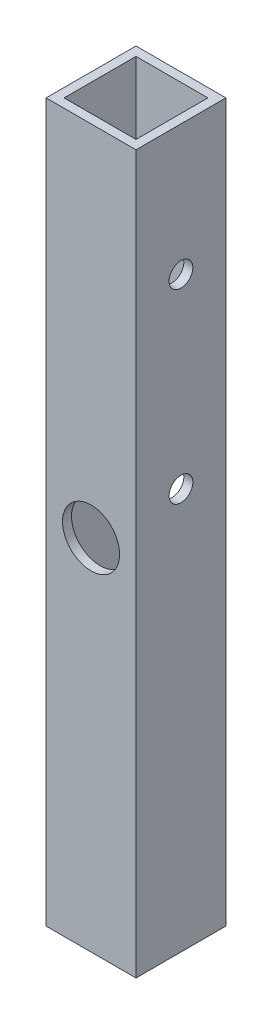
ISO-10303-21;
HEADER;
FILE_DESCRIPTION(('STEP AP214'),'2;1');
FILE_NAME('part.step','',(''),(''),'','','');
FILE_SCHEMA(('AUTOMOTIVE_DESIGN { 1 0 10303 214 1 1 1 1 }'));
ENDSEC;
DATA;
#1=APPLICATION_CONTEXT('core data for automotive mechanical design processes');
#2=APPLICATION_PROTOCOL_DEFINITION('international standard','automotive_design',2000,#1);
#3=PRODUCT_CONTEXT('',#1,'mechanical');
#4=PRODUCT('Part','Part','',(#3));
#5=PRODUCT_RELATED_PRODUCT_CATEGORY('part','',(#4));
#6=PRODUCT_DEFINITION_FORMATION('','',#4);
#7=PRODUCT_DEFINITION_CONTEXT('part definition',#1,'design');
#8=PRODUCT_DEFINITION('design','',#6,#7);
#9=PRODUCT_DEFINITION_SHAPE('','',#8);
#10=(LENGTH_UNIT() NAMED_UNIT(*) SI_UNIT(.MILLI.,.METRE.));
#11=(NAMED_UNIT(*) PLANE_ANGLE_UNIT() SI_UNIT($,.RADIAN.));
#12=(NAMED_UNIT(*) SI_UNIT($,.STERADIAN.) SOLID_ANGLE_UNIT());
#13=UNCERTAINTY_MEASURE_WITH_UNIT(LENGTH_MEASURE(1.E-05),#10,'distance_accuracy_value','');
#14=(GEOMETRIC_REPRESENTATION_CONTEXT(3) GLOBAL_UNCERTAINTY_ASSIGNED_CONTEXT((#13)) GLOBAL_UNIT_ASSIGNED_CONTEXT((#10,
#11,#12)) REPRESENTATION_CONTEXT('',''));
#15=CARTESIAN_POINT('',(0.,0.,0.));
#16=DIRECTION('',(0.,0.,1.));
#17=DIRECTION('',(1.,0.,0.));
#18=AXIS2_PLACEMENT_3D('',#15,#16,#17);
#19=CARTESIAN_POINT('',(0.,0.,2.));
#20=DIRECTION('',(0.,0.,-1.));
#21=DIRECTION('',(-1.,0.,0.));
#22=AXIS2_PLACEMENT_3D('',#19,#20,#21);
#23=PLANE('',#22);
#24=CARTESIAN_POINT('',(0.,0.,2.));
#25=DIRECTION('',(0.,0.,-1.));
#26=DIRECTION('',(-1.,0.,0.));
#27=AXIS2_PLACEMENT_3D('',#24,#25,#26);
#28=CIRCLE('',#27,6.35);
#29=CARTESIAN_POINT('',(-6.35,0.,2.));
#30=VERTEX_POINT('',#29);
#31=EDGE_CURVE('E132',#30,#30,#28,.T.);
#32=ORIENTED_EDGE('',*,*,#31,.T.);
#33=EDGE_LOOP('',(#32));
#34=FACE_BOUND('',#33,.T.);
#35=DIRECTION('',(0.,1.,0.));
#36=VECTOR('',#35,1.);
#37=CARTESIAN_POINT('',(-8.,-106.707248094147,2.));
#38=LINE('',#37,#36);
#39=CARTESIAN_POINT('',(-8.,-79.8,2.));
#40=VERTEX_POINT('',#39);
#41=CARTESIAN_POINT('',(-7.99999999999999,79.8,2.));
#42=VERTEX_POINT('',#41);
#43=EDGE_CURVE('E152',#40,#42,#38,.T.);
#44=ORIENTED_EDGE('',*,*,#43,.F.);
#45=DIRECTION('',(1.,0.,0.));
#46=VECTOR('',#45,1.);
#47=CARTESIAN_POINT('',(-10.,-79.8,2.));
#48=LINE('',#47,#46);
#49=CARTESIAN_POINT('',(8.00000000000001,-79.8,2.));
#50=VERTEX_POINT('',#49);
#51=EDGE_CURVE('E158',#40,#50,#48,.T.);
#52=ORIENTED_EDGE('',*,*,#51,.T.);
#53=DIRECTION('',(0.,1.,0.));
#54=VECTOR('',#53,1.);
#55=CARTESIAN_POINT('',(8.00000000000001,-106.707248094147,2.));
#56=LINE('',#55,#54);
#57=CARTESIAN_POINT('',(8.00000000000001,79.8,2.));
#58=VERTEX_POINT('',#57);
#59=EDGE_CURVE('E65',#50,#58,#56,.T.);
#60=ORIENTED_EDGE('',*,*,#59,.T.);
#61=DIRECTION('',(-1.,0.,0.));
#62=VECTOR('',#61,1.);
#63=CARTESIAN_POINT('',(-9.99999999999999,79.8,2.));
#64=LINE('',#63,#62);
#65=EDGE_CURVE('E60',#58,#42,#64,.T.);
#66=ORIENTED_EDGE('',*,*,#65,.T.);
#67=EDGE_LOOP('',(#44,#52,#60,#66));
#68=FACE_BOUND('',#67,.T.);
#69=ADVANCED_FACE('F43',(#34,#68),#23,.F.);
#70=CARTESIAN_POINT('',(-10.,-79.8,2.));
#71=DIRECTION('',(1.,0.,0.));
#72=DIRECTION('',(0.,1.,0.));
#73=AXIS2_PLACEMENT_3D('',#70,#71,#72);
#74=PLANE('',#73);
#75=CARTESIAN_POINT('',(-10.,50.7999999999958,9.99999999999549));
#76=DIRECTION('',(1.,0.,0.));
#77=DIRECTION('',(0.,1.,0.));
#78=AXIS2_PLACEMENT_3D('',#75,#76,#77);
#79=CIRCLE('',#78,2.65);
#80=CARTESIAN_POINT('',(-10.,53.4499999999958,9.99999999999549));
#81=VERTEX_POINT('',#80);
#82=EDGE_CURVE('E183',#81,#81,#79,.T.);
#83=ORIENTED_EDGE('',*,*,#82,.T.);
#84=EDGE_LOOP('',(#83));
#85=FACE_BOUND('',#84,.T.);
#86=CARTESIAN_POINT('',(-10.,9.4342712474527,9.99999999999938));
#87=DIRECTION('',(1.,0.,0.));
#88=DIRECTION('',(0.,1.,0.));
#89=AXIS2_PLACEMENT_3D('',#86,#87,#88);
#90=CIRCLE('',#89,2.65);
#91=CARTESIAN_POINT('',(-10.,12.0842712474527,9.99999999999938));
#92=VERTEX_POINT('',#91);
#93=EDGE_CURVE('E190',#92,#92,#90,.T.);
#94=ORIENTED_EDGE('',*,*,#93,.T.);
#95=EDGE_LOOP('',(#94));
#96=FACE_BOUND('',#95,.T.);
#97=DIRECTION('',(0.,-1.,0.));
#98=VECTOR('',#97,1.);
#99=CARTESIAN_POINT('',(-10.,-79.8,0.));
#100=LINE('',#99,#98);
#101=CARTESIAN_POINT('',(-9.99999999999999,79.8,0.));
#102=VERTEX_POINT('',#101);
#103=CARTESIAN_POINT('',(-10.,-79.8,0.));
#104=VERTEX_POINT('',#103);
#105=EDGE_CURVE('E157',#102,#104,#100,.T.);
#106=ORIENTED_EDGE('',*,*,#105,.T.);
#107=DIRECTION('',(0.,0.,-1.));
#108=VECTOR('',#107,1.);
#109=CARTESIAN_POINT('',(-10.,-79.8,2.));
#110=LINE('',#109,#108);
#111=CARTESIAN_POINT('',(-9.99999999999999,-79.8,20.));
#112=VERTEX_POINT('',#111);
#113=EDGE_CURVE('E11',#112,#104,#110,.T.);
#114=ORIENTED_EDGE('',*,*,#113,.F.);
#115=DIRECTION('',(0.,1.,0.));
#116=VECTOR('',#115,1.);
#117=CARTESIAN_POINT('',(-9.99999999999999,-106.707248094147,20.));
#118=LINE('',#117,#116);
#119=CARTESIAN_POINT('',(-9.99999999999999,79.8,20.));
#120=VERTEX_POINT('',#119);
#121=EDGE_CURVE('E149',#112,#120,#118,.T.);
#122=ORIENTED_EDGE('',*,*,#121,.T.);
#123=DIRECTION('',(0.,0.,-1.));
#124=VECTOR('',#123,1.);
#125=CARTESIAN_POINT('',(-9.99999999999999,79.8,2.));
#126=LINE('',#125,#124);
#127=EDGE_CURVE('E162',#120,#102,#126,.T.);
#128=ORIENTED_EDGE('',*,*,#127,.T.);
#129=EDGE_LOOP('',(#106,#114,#122,#128));
#130=FACE_BOUND('',#129,.T.);
#131=ADVANCED_FACE('F45',(#85,#96,#130),#74,.F.);
#132=CARTESIAN_POINT('',(-10.,-79.8,2.));
#133=DIRECTION('',(0.,1.,0.));
#134=DIRECTION('',(0.,0.,1.));
#135=AXIS2_PLACEMENT_3D('',#132,#133,#134);
#136=PLANE('',#135);
#137=ORIENTED_EDGE('',*,*,#51,.F.);
#138=DIRECTION('',(0.,0.,-1.));
#139=VECTOR('',#138,1.);
#140=CARTESIAN_POINT('',(-8.,-79.8,0.));
#141=LINE('',#140,#139);
#142=CARTESIAN_POINT('',(-7.99999999999999,-79.8,18.));
#143=VERTEX_POINT('',#142);
#144=EDGE_CURVE('E209',#143,#40,#141,.T.);
#145=ORIENTED_EDGE('',*,*,#144,.F.);
#146=DIRECTION('',(-1.,0.,0.));
#147=VECTOR('',#146,1.);
#148=CARTESIAN_POINT('',(0.,-79.8,18.));
#149=LINE('',#148,#147);
#150=CARTESIAN_POINT('',(8.00000000000001,-79.8,18.));
#151=VERTEX_POINT('',#150);
#152=EDGE_CURVE('E148',#151,#143,#149,.T.);
#153=ORIENTED_EDGE('',*,*,#152,.F.);
#154=DIRECTION('',(0.,0.,-1.));
#155=VECTOR('',#154,1.);
#156=CARTESIAN_POINT('',(8.00000000000001,-79.8,0.));
#157=LINE('',#156,#155);
#158=EDGE_CURVE('E116',#151,#50,#157,.T.);
#159=ORIENTED_EDGE('',*,*,#158,.T.);
#160=EDGE_LOOP('',(#137,#145,#153,#159));
#161=FACE_BOUND('',#160,.T.);
#162=DIRECTION('',(1.,0.,0.));
#163=VECTOR('',#162,1.);
#164=CARTESIAN_POINT('',(-10.,-79.8,0.));
#165=LINE('',#164,#163);
#166=CARTESIAN_POINT('',(10.,-79.8,0.));
#167=VERTEX_POINT('',#166);
#168=EDGE_CURVE('E165',#104,#167,#165,.T.);
#169=ORIENTED_EDGE('',*,*,#168,.T.);
#170=DIRECTION('',(0.,0.,-1.));
#171=VECTOR('',#170,1.);
#172=CARTESIAN_POINT('',(10.,-79.8,2.));
#173=LINE('',#172,#171);
#174=CARTESIAN_POINT('',(10.,-79.8,20.));
#175=VERTEX_POINT('',#174);
#176=EDGE_CURVE('E52',#175,#167,#173,.T.);
#177=ORIENTED_EDGE('',*,*,#176,.F.);
#178=DIRECTION('',(-1.,0.,0.));
#179=VECTOR('',#178,1.);
#180=CARTESIAN_POINT('',(0.,-79.8,20.));
#181=LINE('',#180,#179);
#182=EDGE_CURVE('E138',#175,#112,#181,.T.);
#183=ORIENTED_EDGE('',*,*,#182,.T.);
#184=ORIENTED_EDGE('',*,*,#113,.T.);
#185=EDGE_LOOP('',(#169,#177,#183,#184));
#186=FACE_BOUND('',#185,.T.);
#187=ADVANCED_FACE('F216',(#161,#186),#136,.F.);
#188=CARTESIAN_POINT('',(10.,-79.8,2.));
#189=DIRECTION('',(-1.,0.,0.));
#190=DIRECTION('',(0.,-1.,0.));
#191=AXIS2_PLACEMENT_3D('',#188,#189,#190);
#192=PLANE('',#191);
#193=CARTESIAN_POINT('',(10.,50.7999999999958,9.99999999999549));
#194=DIRECTION('',(-1.,0.,0.));
#195=DIRECTION('',(0.,-1.,0.));
#196=AXIS2_PLACEMENT_3D('',#193,#194,#195);
#197=CIRCLE('',#196,2.65);
#198=CARTESIAN_POINT('',(10.,48.1499999999958,9.99999999999549));
#199=VERTEX_POINT('',#198);
#200=EDGE_CURVE('E202',#199,#199,#197,.T.);
#201=ORIENTED_EDGE('',*,*,#200,.T.);
#202=EDGE_LOOP('',(#201));
#203=FACE_BOUND('',#202,.T.);
#204=CARTESIAN_POINT('',(10.,9.4342712474527,9.99999999999938));
#205=DIRECTION('',(-1.,0.,0.));
#206=DIRECTION('',(0.,-1.,0.));
#207=AXIS2_PLACEMENT_3D('',#204,#205,#206);
#208=CIRCLE('',#207,2.65);
#209=CARTESIAN_POINT('',(10.,6.78427124745271,9.99999999999938));
#210=VERTEX_POINT('',#209);
#211=EDGE_CURVE('E187',#210,#210,#208,.T.);
#212=ORIENTED_EDGE('',*,*,#211,.T.);
#213=EDGE_LOOP('',(#212));
#214=FACE_BOUND('',#213,.T.);
#215=DIRECTION('',(0.,1.,0.));
#216=VECTOR('',#215,1.);
#217=CARTESIAN_POINT('',(10.,-79.8,0.));
#218=LINE('',#217,#216);
#219=CARTESIAN_POINT('',(10.,79.8,0.));
#220=VERTEX_POINT('',#219);
#221=EDGE_CURVE('E167',#167,#220,#218,.T.);
#222=ORIENTED_EDGE('',*,*,#221,.T.);
#223=DIRECTION('',(0.,0.,-1.));
#224=VECTOR('',#223,1.);
#225=CARTESIAN_POINT('',(10.,79.8,2.));
#226=LINE('',#225,#224);
#227=CARTESIAN_POINT('',(10.,79.8,20.));
#228=VERTEX_POINT('',#227);
#229=EDGE_CURVE('E172',#228,#220,#226,.T.);
#230=ORIENTED_EDGE('',*,*,#229,.F.);
#231=DIRECTION('',(0.,1.,0.));
#232=VECTOR('',#231,1.);
#233=CARTESIAN_POINT('',(10.,-106.707248094147,20.));
#234=LINE('',#233,#232);
#235=EDGE_CURVE('E145',#175,#228,#234,.T.);
#236=ORIENTED_EDGE('',*,*,#235,.F.);
#237=ORIENTED_EDGE('',*,*,#176,.T.);
#238=EDGE_LOOP('',(#222,#230,#236,#237));
#239=FACE_BOUND('',#238,.T.);
#240=ADVANCED_FACE('F228',(#203,#214,#239),#192,.F.);
#241=CARTESIAN_POINT('',(-9.99999999999999,79.8,2.));
#242=DIRECTION('',(0.,-1.,0.));
#243=DIRECTION('',(0.,0.,-1.));
#244=AXIS2_PLACEMENT_3D('',#241,#242,#243);
#245=PLANE('',#244);
#246=DIRECTION('',(0.,0.,1.));
#247=VECTOR('',#246,1.);
#248=CARTESIAN_POINT('',(-8.,79.8,0.));
#249=LINE('',#248,#247);
#250=CARTESIAN_POINT('',(-7.99999999999999,79.8,18.));
#251=VERTEX_POINT('',#250);
#252=EDGE_CURVE('E128',#42,#251,#249,.T.);
#253=ORIENTED_EDGE('',*,*,#252,.F.);
#254=ORIENTED_EDGE('',*,*,#65,.F.);
#255=DIRECTION('',(0.,0.,1.));
#256=VECTOR('',#255,1.);
#257=CARTESIAN_POINT('',(8.00000000000001,79.8,0.));
#258=LINE('',#257,#256);
#259=CARTESIAN_POINT('',(8.00000000000001,79.8,18.));
#260=VERTEX_POINT('',#259);
#261=EDGE_CURVE('E114',#58,#260,#258,.T.);
#262=ORIENTED_EDGE('',*,*,#261,.T.);
#263=DIRECTION('',(1.,0.,0.));
#264=VECTOR('',#263,1.);
#265=CARTESIAN_POINT('',(0.,79.8,18.));
#266=LINE('',#265,#264);
#267=EDGE_CURVE('E122',#251,#260,#266,.T.);
#268=ORIENTED_EDGE('',*,*,#267,.F.);
#269=EDGE_LOOP('',(#253,#254,#262,#268));
#270=FACE_BOUND('',#269,.T.);
#271=DIRECTION('',(-1.,0.,0.));
#272=VECTOR('',#271,1.);
#273=CARTESIAN_POINT('',(-9.99999999999999,79.8,0.));
#274=LINE('',#273,#272);
#275=EDGE_CURVE('E160',#220,#102,#274,.T.);
#276=ORIENTED_EDGE('',*,*,#275,.T.);
#277=ORIENTED_EDGE('',*,*,#127,.F.);
#278=DIRECTION('',(1.,0.,0.));
#279=VECTOR('',#278,1.);
#280=CARTESIAN_POINT('',(0.,79.8,20.));
#281=LINE('',#280,#279);
#282=EDGE_CURVE('E142',#120,#228,#281,.T.);
#283=ORIENTED_EDGE('',*,*,#282,.T.);
#284=ORIENTED_EDGE('',*,*,#229,.T.);
#285=EDGE_LOOP('',(#276,#277,#283,#284));
#286=FACE_BOUND('',#285,.T.);
#287=ADVANCED_FACE('F130',(#270,#286),#245,.F.);
#288=CARTESIAN_POINT('',(0.,0.,0.));
#289=DIRECTION('',(0.,0.,-1.));
#290=DIRECTION('',(-1.,0.,0.));
#291=AXIS2_PLACEMENT_3D('',#288,#289,#290);
#292=PLANE('',#291);
#293=CARTESIAN_POINT('',(0.,0.,0.));
#294=DIRECTION('',(0.,0.,-1.));
#295=DIRECTION('',(-1.,0.,0.));
#296=AXIS2_PLACEMENT_3D('',#293,#294,#295);
#297=CIRCLE('',#296,6.35);
#298=CARTESIAN_POINT('',(-6.35,0.,0.));
#299=VERTEX_POINT('',#298);
#300=EDGE_CURVE('E135',#299,#299,#297,.T.);
#301=ORIENTED_EDGE('',*,*,#300,.F.);
#302=EDGE_LOOP('',(#301));
#303=FACE_BOUND('',#302,.T.);
#304=ORIENTED_EDGE('',*,*,#105,.F.);
#305=ORIENTED_EDGE('',*,*,#275,.F.);
#306=ORIENTED_EDGE('',*,*,#221,.F.);
#307=ORIENTED_EDGE('',*,*,#168,.F.);
#308=EDGE_LOOP('',(#304,#305,#306,#307));
#309=FACE_BOUND('',#308,.T.);
#310=ADVANCED_FACE('F225',(#303,#309),#292,.T.);
#311=CARTESIAN_POINT('',(0.,-106.707248094147,20.));
#312=DIRECTION('',(0.,0.,1.));
#313=DIRECTION('',(1.,0.,0.));
#314=AXIS2_PLACEMENT_3D('',#311,#312,#313);
#315=PLANE('',#314);
#316=CARTESIAN_POINT('',(0.,0.,20.));
#317=DIRECTION('',(0.,0.,-1.));
#318=DIRECTION('',(-1.,0.,0.));
#319=AXIS2_PLACEMENT_3D('',#316,#317,#318);
#320=CIRCLE('',#319,6.35);
#321=CARTESIAN_POINT('',(-6.35,0.,20.));
#322=VERTEX_POINT('',#321);
#323=EDGE_CURVE('E179',#322,#322,#320,.T.);
#324=ORIENTED_EDGE('',*,*,#323,.T.);
#325=EDGE_LOOP('',(#324));
#326=FACE_BOUND('',#325,.T.);
#327=ORIENTED_EDGE('',*,*,#182,.F.);
#328=ORIENTED_EDGE('',*,*,#235,.T.);
#329=ORIENTED_EDGE('',*,*,#282,.F.);
#330=ORIENTED_EDGE('',*,*,#121,.F.);
#331=EDGE_LOOP('',(#327,#328,#329,#330));
#332=FACE_BOUND('',#331,.T.);
#333=ADVANCED_FACE('F220',(#326,#332),#315,.T.);
#334=CARTESIAN_POINT('',(-8.,-106.707248094147,0.));
#335=DIRECTION('',(-1.,0.,0.));
#336=DIRECTION('',(0.,0.,1.));
#337=AXIS2_PLACEMENT_3D('',#334,#335,#336);
#338=PLANE('',#337);
#339=CARTESIAN_POINT('',(-7.99999999999999,50.7999999999958,9.99999999999549));
#340=DIRECTION('',(-1.,0.,0.));
#341=DIRECTION('',(0.,0.,1.));
#342=AXIS2_PLACEMENT_3D('',#339,#340,#341);
#343=CIRCLE('',#342,2.65);
#344=CARTESIAN_POINT('',(-7.99999999999999,50.7999999999958,12.6499999999955));
#345=VERTEX_POINT('',#344);
#346=EDGE_CURVE('E199',#345,#345,#343,.T.);
#347=ORIENTED_EDGE('',*,*,#346,.T.);
#348=EDGE_LOOP('',(#347));
#349=FACE_BOUND('',#348,.T.);
#350=CARTESIAN_POINT('',(-7.99999999999999,9.4342712474527,9.99999999999938));
#351=DIRECTION('',(-1.,0.,0.));
#352=DIRECTION('',(0.,0.,1.));
#353=AXIS2_PLACEMENT_3D('',#350,#351,#352);
#354=CIRCLE('',#353,2.65);
#355=CARTESIAN_POINT('',(-7.99999999999999,9.4342712474527,12.6499999999994));
#356=VERTEX_POINT('',#355);
#357=EDGE_CURVE('E182',#356,#356,#354,.T.);
#358=ORIENTED_EDGE('',*,*,#357,.T.);
#359=EDGE_LOOP('',(#358));
#360=FACE_BOUND('',#359,.T.);
#361=DIRECTION('',(0.,1.,0.));
#362=VECTOR('',#361,1.);
#363=CARTESIAN_POINT('',(-7.99999999999999,-106.707248094147,18.));
#364=LINE('',#363,#362);
#365=EDGE_CURVE('E119',#143,#251,#364,.T.);
#366=ORIENTED_EDGE('',*,*,#365,.F.);
#367=ORIENTED_EDGE('',*,*,#144,.T.);
#368=ORIENTED_EDGE('',*,*,#43,.T.);
#369=ORIENTED_EDGE('',*,*,#252,.T.);
#370=EDGE_LOOP('',(#366,#367,#368,#369));
#371=FACE_BOUND('',#370,.T.);
#372=ADVANCED_FACE('F253',(#349,#360,#371),#338,.F.);
#373=CARTESIAN_POINT('',(0.,-106.707248094147,18.));
#374=DIRECTION('',(0.,0.,1.));
#375=DIRECTION('',(1.,0.,0.));
#376=AXIS2_PLACEMENT_3D('',#373,#374,#375);
#377=PLANE('',#376);
#378=CARTESIAN_POINT('',(0.,0.,18.));
#379=DIRECTION('',(0.,0.,1.));
#380=DIRECTION('',(1.,0.,0.));
#381=AXIS2_PLACEMENT_3D('',#378,#379,#380);
#382=CIRCLE('',#381,6.35);
#383=CARTESIAN_POINT('',(6.35,0.,18.));
#384=VERTEX_POINT('',#383);
#385=EDGE_CURVE('E177',#384,#384,#382,.T.);
#386=ORIENTED_EDGE('',*,*,#385,.T.);
#387=EDGE_LOOP('',(#386));
#388=FACE_BOUND('',#387,.T.);
#389=DIRECTION('',(0.,1.,0.));
#390=VECTOR('',#389,1.);
#391=CARTESIAN_POINT('',(8.00000000000001,-106.707248094147,18.));
#392=LINE('',#391,#390);
#393=EDGE_CURVE('E110',#151,#260,#392,.T.);
#394=ORIENTED_EDGE('',*,*,#393,.F.);
#395=ORIENTED_EDGE('',*,*,#152,.T.);
#396=ORIENTED_EDGE('',*,*,#365,.T.);
#397=ORIENTED_EDGE('',*,*,#267,.T.);
#398=EDGE_LOOP('',(#394,#395,#396,#397));
#399=FACE_BOUND('',#398,.T.);
#400=ADVANCED_FACE('F123',(#388,#399),#377,.F.);
#401=CARTESIAN_POINT('',(8.00000000000001,-106.707248094147,0.));
#402=DIRECTION('',(-1.,0.,0.));
#403=DIRECTION('',(0.,0.,1.));
#404=AXIS2_PLACEMENT_3D('',#401,#402,#403);
#405=PLANE('',#404);
#406=CARTESIAN_POINT('',(8.00000000000001,50.7999999999958,9.99999999999549));
#407=DIRECTION('',(-1.,0.,0.));
#408=DIRECTION('',(0.,0.,1.));
#409=AXIS2_PLACEMENT_3D('',#406,#407,#408);
#410=CIRCLE('',#409,2.65);
#411=CARTESIAN_POINT('',(8.00000000000001,50.7999999999958,12.6499999999955));
#412=VERTEX_POINT('',#411);
#413=EDGE_CURVE('E47',#412,#412,#410,.T.);
#414=ORIENTED_EDGE('',*,*,#413,.F.);
#415=EDGE_LOOP('',(#414));
#416=FACE_BOUND('',#415,.T.);
#417=CARTESIAN_POINT('',(8.00000000000001,9.4342712474527,9.99999999999938));
#418=DIRECTION('',(-1.,0.,0.));
#419=DIRECTION('',(0.,0.,1.));
#420=AXIS2_PLACEMENT_3D('',#417,#418,#419);
#421=CIRCLE('',#420,2.65);
#422=CARTESIAN_POINT('',(8.00000000000001,9.4342712474527,12.6499999999994));
#423=VERTEX_POINT('',#422);
#424=EDGE_CURVE('E180',#423,#423,#421,.T.);
#425=ORIENTED_EDGE('',*,*,#424,.F.);
#426=EDGE_LOOP('',(#425));
#427=FACE_BOUND('',#426,.T.);
#428=ORIENTED_EDGE('',*,*,#158,.F.);
#429=ORIENTED_EDGE('',*,*,#393,.T.);
#430=ORIENTED_EDGE('',*,*,#261,.F.);
#431=ORIENTED_EDGE('',*,*,#59,.F.);
#432=EDGE_LOOP('',(#428,#429,#430,#431));
#433=FACE_BOUND('',#432,.T.);
#434=ADVANCED_FACE('F112',(#416,#427,#433),#405,.T.);
#435=CARTESIAN_POINT('',(0.,0.,20.));
#436=DIRECTION('',(0.,0.,-1.));
#437=DIRECTION('',(-1.,0.,0.));
#438=AXIS2_PLACEMENT_3D('',#435,#436,#437);
#439=CYLINDRICAL_SURFACE('',#438,6.35);
#440=ORIENTED_EDGE('',*,*,#323,.F.);
#441=EDGE_LOOP('',(#440));
#442=FACE_BOUND('',#441,.T.);
#443=ORIENTED_EDGE('',*,*,#385,.F.);
#444=EDGE_LOOP('',(#443));
#445=FACE_BOUND('',#444,.T.);
#446=ADVANCED_FACE('F249',(#442,#445),#439,.F.);
#447=ORIENTED_EDGE('',*,*,#300,.T.);
#448=EDGE_LOOP('',(#447));
#449=FACE_BOUND('',#448,.T.);
#450=ORIENTED_EDGE('',*,*,#31,.F.);
#451=EDGE_LOOP('',(#450));
#452=FACE_BOUND('',#451,.T.);
#453=ADVANCED_FACE('F261',(#449,#452),#439,.F.);
#454=CARTESIAN_POINT('',(-10.,9.4342712474527,9.99999999999938));
#455=DIRECTION('',(1.,0.,0.));
#456=DIRECTION('',(0.,1.,0.));
#457=AXIS2_PLACEMENT_3D('',#454,#455,#456);
#458=CYLINDRICAL_SURFACE('',#457,2.65);
#459=ORIENTED_EDGE('',*,*,#424,.T.);
#460=EDGE_LOOP('',(#459));
#461=FACE_BOUND('',#460,.T.);
#462=ORIENTED_EDGE('',*,*,#211,.F.);
#463=EDGE_LOOP('',(#462));
#464=FACE_BOUND('',#463,.T.);
#465=ADVANCED_FACE('F264',(#461,#464),#458,.F.);
#466=CARTESIAN_POINT('',(-10.,50.7999999999958,9.99999999999549));
#467=DIRECTION('',(1.,0.,0.));
#468=DIRECTION('',(0.,1.,0.));
#469=AXIS2_PLACEMENT_3D('',#466,#467,#468);
#470=CYLINDRICAL_SURFACE('',#469,2.65);
#471=ORIENTED_EDGE('',*,*,#413,.T.);
#472=EDGE_LOOP('',(#471));
#473=FACE_BOUND('',#472,.T.);
#474=ORIENTED_EDGE('',*,*,#200,.F.);
#475=EDGE_LOOP('',(#474));
#476=FACE_BOUND('',#475,.T.);
#477=ADVANCED_FACE('F268',(#473,#476),#470,.F.);
#478=ORIENTED_EDGE('',*,*,#93,.F.);
#479=EDGE_LOOP('',(#478));
#480=FACE_BOUND('',#479,.T.);
#481=ORIENTED_EDGE('',*,*,#357,.F.);
#482=EDGE_LOOP('',(#481));
#483=FACE_BOUND('',#482,.T.);
#484=ADVANCED_FACE('F269',(#480,#483),#458,.F.);
#485=ORIENTED_EDGE('',*,*,#82,.F.);
#486=EDGE_LOOP('',(#485));
#487=FACE_BOUND('',#486,.T.);
#488=ORIENTED_EDGE('',*,*,#346,.F.);
#489=EDGE_LOOP('',(#488));
#490=FACE_BOUND('',#489,.T.);
#491=ADVANCED_FACE('F272',(#487,#490),#470,.F.);
#492=CLOSED_SHELL('',(#69,#131,#187,#240,#287,#310,#333,#372,#400,#434,#446,#453,#465,#477,#484,#491));
#493=MANIFOLD_SOLID_BREP('B2',#492);
#494=ADVANCED_BREP_SHAPE_REPRESENTATION('',(#18,#493),#14);
#495=SHAPE_DEFINITION_REPRESENTATION(#9,#494);
ENDSEC;
END-ISO-10303-21;
